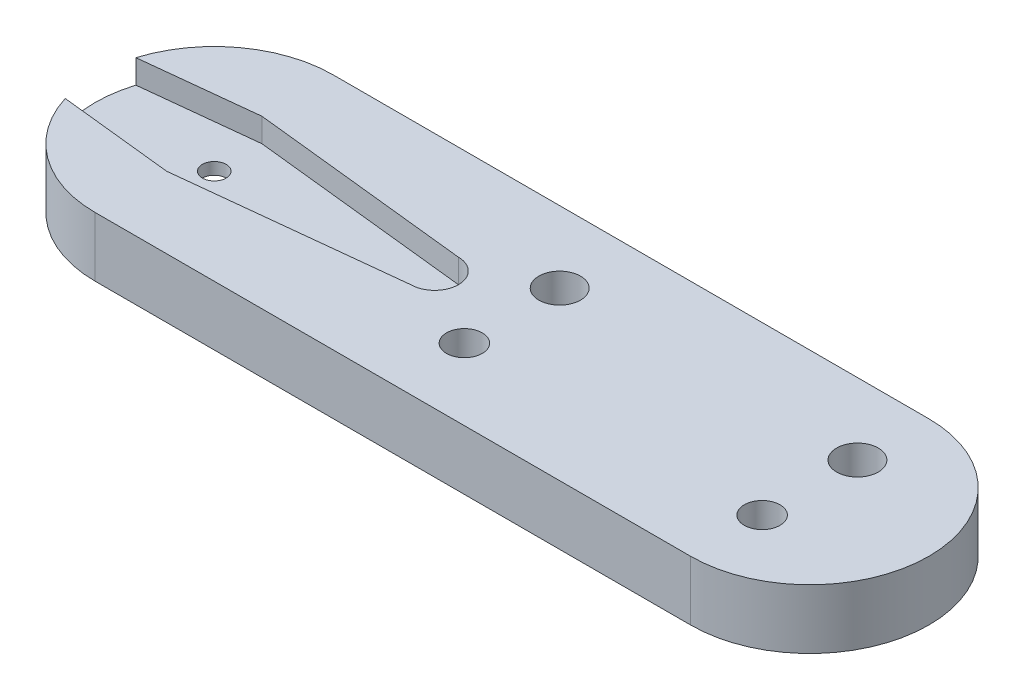
ISO-10303-21;
HEADER;
FILE_DESCRIPTION(('STEP AP214'),'2;1');
FILE_NAME('part.step','',(''),(''),'','','');
FILE_SCHEMA(('AUTOMOTIVE_DESIGN { 1 0 10303 214 1 1 1 1 }'));
ENDSEC;
DATA;
#1=APPLICATION_CONTEXT('core data for automotive mechanical design processes');
#2=APPLICATION_PROTOCOL_DEFINITION('international standard','automotive_design',2000,#1);
#3=PRODUCT_CONTEXT('',#1,'mechanical');
#4=PRODUCT('Part','Part','',(#3));
#5=PRODUCT_RELATED_PRODUCT_CATEGORY('part','',(#4));
#6=PRODUCT_DEFINITION_FORMATION('','',#4);
#7=PRODUCT_DEFINITION_CONTEXT('part definition',#1,'design');
#8=PRODUCT_DEFINITION('design','',#6,#7);
#9=PRODUCT_DEFINITION_SHAPE('','',#8);
#10=(LENGTH_UNIT() NAMED_UNIT(*) SI_UNIT(.MILLI.,.METRE.));
#11=(NAMED_UNIT(*) PLANE_ANGLE_UNIT() SI_UNIT($,.RADIAN.));
#12=(NAMED_UNIT(*) SI_UNIT($,.STERADIAN.) SOLID_ANGLE_UNIT());
#13=UNCERTAINTY_MEASURE_WITH_UNIT(LENGTH_MEASURE(1.E-05),#10,'distance_accuracy_value','');
#14=(GEOMETRIC_REPRESENTATION_CONTEXT(3) GLOBAL_UNCERTAINTY_ASSIGNED_CONTEXT((#13)) GLOBAL_UNIT_ASSIGNED_CONTEXT((#10,
#11,#12)) REPRESENTATION_CONTEXT('',''));
#15=CARTESIAN_POINT('',(0.,0.,0.));
#16=DIRECTION('',(0.,0.,1.));
#17=DIRECTION('',(1.,0.,0.));
#18=AXIS2_PLACEMENT_3D('',#15,#16,#17);
#19=CARTESIAN_POINT('',(-25.,0.,0.));
#20=DIRECTION('',(0.,1.,0.));
#21=DIRECTION('',(0.,0.,1.));
#22=AXIS2_PLACEMENT_3D('',#19,#20,#21);
#23=CYLINDRICAL_SURFACE('',#22,1.);
#24=CARTESIAN_POINT('',(-25.,3.,0.));
#25=DIRECTION('',(0.,1.,0.));
#26=DIRECTION('',(0.,0.,1.));
#27=AXIS2_PLACEMENT_3D('',#24,#25,#26);
#28=CIRCLE('',#27,1.);
#29=CARTESIAN_POINT('',(-25.,3.,1.));
#30=VERTEX_POINT('',#29);
#31=EDGE_CURVE('E156',#30,#30,#28,.F.);
#32=ORIENTED_EDGE('',*,*,#31,.F.);
#33=EDGE_LOOP('',(#32));
#34=FACE_BOUND('',#33,.T.);
#35=CARTESIAN_POINT('',(-25.,2.,0.));
#36=DIRECTION('',(0.,-1.,0.));
#37=DIRECTION('',(0.,0.,-1.));
#38=AXIS2_PLACEMENT_3D('',#35,#36,#37);
#39=CIRCLE('',#38,1.);
#40=CARTESIAN_POINT('',(-25.,2.,-1.));
#41=VERTEX_POINT('',#40);
#42=EDGE_CURVE('E43',#41,#41,#39,.F.);
#43=ORIENTED_EDGE('',*,*,#42,.F.);
#44=EDGE_LOOP('',(#43));
#45=FACE_BOUND('',#44,.T.);
#46=ADVANCED_FACE('F39',(#34,#45),#23,.F.);
#47=CARTESIAN_POINT('',(-25.,5.,0.));
#48=DIRECTION('',(0.,-1.,0.));
#49=DIRECTION('',(0.,0.,-1.));
#50=AXIS2_PLACEMENT_3D('',#47,#48,#49);
#51=CYLINDRICAL_SURFACE('',#50,10.);
#52=DIRECTION('',(0.,-1.,0.));
#53=VECTOR('',#52,1.);
#54=CARTESIAN_POINT('',(-34.5495147182902,5.,-2.96762003045511));
#55=LINE('',#54,#53);
#56=CARTESIAN_POINT('',(-34.5495147182902,5.,-2.96762003045511));
#57=VERTEX_POINT('',#56);
#58=CARTESIAN_POINT('',(-34.5495147182902,3.,-2.96762003045511));
#59=VERTEX_POINT('',#58);
#60=EDGE_CURVE('E136',#57,#59,#55,.T.);
#61=ORIENTED_EDGE('',*,*,#60,.F.);
#62=CARTESIAN_POINT('',(-25.,5.,0.));
#63=DIRECTION('',(0.,1.,0.));
#64=DIRECTION('',(0.,0.,1.));
#65=AXIS2_PLACEMENT_3D('',#62,#63,#64);
#66=CIRCLE('',#65,10.);
#67=CARTESIAN_POINT('',(-25.,5.,-10.));
#68=VERTEX_POINT('',#67);
#69=EDGE_CURVE('E180',#68,#57,#66,.T.);
#70=ORIENTED_EDGE('',*,*,#69,.F.);
#71=DIRECTION('',(0.,-1.,0.));
#72=VECTOR('',#71,1.);
#73=CARTESIAN_POINT('',(-25.,5.,-10.));
#74=LINE('',#73,#72);
#75=CARTESIAN_POINT('',(-25.,0.,-10.));
#76=VERTEX_POINT('',#75);
#77=EDGE_CURVE('E49',#68,#76,#74,.T.);
#78=ORIENTED_EDGE('',*,*,#77,.T.);
#79=CARTESIAN_POINT('',(-25.,0.,0.));
#80=DIRECTION('',(0.,1.,0.));
#81=DIRECTION('',(0.,0.,1.));
#82=AXIS2_PLACEMENT_3D('',#79,#80,#81);
#83=CIRCLE('',#82,10.);
#84=CARTESIAN_POINT('',(-25.,0.,10.));
#85=VERTEX_POINT('',#84);
#86=EDGE_CURVE('E193',#76,#85,#83,.T.);
#87=ORIENTED_EDGE('',*,*,#86,.T.);
#88=DIRECTION('',(0.,-1.,0.));
#89=VECTOR('',#88,1.);
#90=CARTESIAN_POINT('',(-25.,5.,10.));
#91=LINE('',#90,#89);
#92=CARTESIAN_POINT('',(-25.,5.,10.));
#93=VERTEX_POINT('',#92);
#94=EDGE_CURVE('E200',#93,#85,#91,.T.);
#95=ORIENTED_EDGE('',*,*,#94,.F.);
#96=CARTESIAN_POINT('',(-34.5495147182902,5.,2.96762003045511));
#97=VERTEX_POINT('',#96);
#98=EDGE_CURVE('E179',#97,#93,#66,.T.);
#99=ORIENTED_EDGE('',*,*,#98,.F.);
#100=DIRECTION('',(0.,-1.,0.));
#101=VECTOR('',#100,1.);
#102=CARTESIAN_POINT('',(-34.5495147182902,5.,2.96762003045511));
#103=LINE('',#102,#101);
#104=CARTESIAN_POINT('',(-34.5495147182902,3.,2.96762003045511));
#105=VERTEX_POINT('',#104);
#106=EDGE_CURVE('E57',#97,#105,#103,.T.);
#107=ORIENTED_EDGE('',*,*,#106,.T.);
#108=CARTESIAN_POINT('',(-25.,3.,0.));
#109=DIRECTION('',(0.,1.,0.));
#110=DIRECTION('',(0.,0.,1.));
#111=AXIS2_PLACEMENT_3D('',#108,#109,#110);
#112=CIRCLE('',#111,10.);
#113=EDGE_CURVE('E162',#59,#105,#112,.T.);
#114=ORIENTED_EDGE('',*,*,#113,.F.);
#115=EDGE_LOOP('',(#61,#70,#78,#87,#95,#99,#107,#114));
#116=FACE_BOUND('',#115,.T.);
#117=ADVANCED_FACE('F208',(#116),#51,.T.);
#118=CARTESIAN_POINT('',(25.,5.,0.));
#119=DIRECTION('',(0.,1.,0.));
#120=DIRECTION('',(0.,0.,1.));
#121=AXIS2_PLACEMENT_3D('',#118,#119,#120);
#122=PLANE('',#121);
#123=CARTESIAN_POINT('',(0.,5.,-4.));
#124=DIRECTION('',(0.,1.,0.));
#125=DIRECTION('',(0.,0.,1.));
#126=AXIS2_PLACEMENT_3D('',#123,#124,#125);
#127=CIRCLE('',#126,1.75);
#128=CARTESIAN_POINT('',(0.,5.,-2.25));
#129=VERTEX_POINT('',#128);
#130=EDGE_CURVE('E290',#129,#129,#127,.T.);
#131=ORIENTED_EDGE('',*,*,#130,.F.);
#132=EDGE_LOOP('',(#131));
#133=FACE_BOUND('',#132,.T.);
#134=CARTESIAN_POINT('',(0.,5.,4.));
#135=DIRECTION('',(0.,1.,0.));
#136=DIRECTION('',(0.,0.,1.));
#137=AXIS2_PLACEMENT_3D('',#134,#135,#136);
#138=CIRCLE('',#137,1.5);
#139=CARTESIAN_POINT('',(0.,5.,5.5));
#140=VERTEX_POINT('',#139);
#141=EDGE_CURVE('E282',#140,#140,#138,.T.);
#142=ORIENTED_EDGE('',*,*,#141,.F.);
#143=EDGE_LOOP('',(#142));
#144=FACE_BOUND('',#143,.T.);
#145=CARTESIAN_POINT('',(25.,5.,-4.));
#146=DIRECTION('',(0.,1.,0.));
#147=DIRECTION('',(0.,0.,1.));
#148=AXIS2_PLACEMENT_3D('',#145,#146,#147);
#149=CIRCLE('',#148,1.75);
#150=CARTESIAN_POINT('',(25.,5.,-2.25));
#151=VERTEX_POINT('',#150);
#152=EDGE_CURVE('E275',#151,#151,#149,.T.);
#153=ORIENTED_EDGE('',*,*,#152,.F.);
#154=EDGE_LOOP('',(#153));
#155=FACE_BOUND('',#154,.T.);
#156=CARTESIAN_POINT('',(25.,5.,4.));
#157=DIRECTION('',(0.,1.,0.));
#158=DIRECTION('',(0.,0.,1.));
#159=AXIS2_PLACEMENT_3D('',#156,#157,#158);
#160=CIRCLE('',#159,1.5);
#161=CARTESIAN_POINT('',(25.,5.,5.5));
#162=VERTEX_POINT('',#161);
#163=EDGE_CURVE('E266',#162,#162,#160,.T.);
#164=ORIENTED_EDGE('',*,*,#163,.F.);
#165=EDGE_LOOP('',(#164));
#166=FACE_BOUND('',#165,.T.);
#167=ORIENTED_EDGE('',*,*,#69,.T.);
#168=DIRECTION('',(0.994207047565849,0.,-0.107481842980092));
#169=VECTOR('',#168,1.);
#170=CARTESIAN_POINT('',(-43.5,5.,-2.));
#171=LINE('',#170,#169);
#172=CARTESIAN_POINT('',(-25.,5.,-4.));
#173=VERTEX_POINT('',#172);
#174=EDGE_CURVE('E245',#57,#173,#171,.T.);
#175=ORIENTED_EDGE('',*,*,#174,.T.);
#176=DIRECTION('',(0.994207047565849,0.,0.107481842980092));
#177=VECTOR('',#176,1.);
#178=CARTESIAN_POINT('',(-25.,5.,-4.));
#179=LINE('',#178,#177);
#180=CARTESIAN_POINT('',(-6.49999999999996,5.,-2.));
#181=VERTEX_POINT('',#180);
#182=EDGE_CURVE('E154',#173,#181,#179,.T.);
#183=ORIENTED_EDGE('',*,*,#182,.T.);
#184=CARTESIAN_POINT('',(-6.49999999999996,5.,0.));
#185=DIRECTION('',(0.,1.,0.));
#186=DIRECTION('',(0.,0.,1.));
#187=AXIS2_PLACEMENT_3D('',#184,#185,#186);
#188=CIRCLE('',#187,2.);
#189=CARTESIAN_POINT('',(-6.49999999999996,5.,2.));
#190=VERTEX_POINT('',#189);
#191=EDGE_CURVE('E229',#190,#181,#188,.T.);
#192=ORIENTED_EDGE('',*,*,#191,.F.);
#193=DIRECTION('',(0.994207047565849,0.,-0.107481842980092));
#194=VECTOR('',#193,1.);
#195=CARTESIAN_POINT('',(-25.,5.,4.));
#196=LINE('',#195,#194);
#197=CARTESIAN_POINT('',(-25.,5.,4.));
#198=VERTEX_POINT('',#197);
#199=EDGE_CURVE('E223',#198,#190,#196,.T.);
#200=ORIENTED_EDGE('',*,*,#199,.F.);
#201=DIRECTION('',(0.994207047565849,0.,0.107481842980092));
#202=VECTOR('',#201,1.);
#203=CARTESIAN_POINT('',(-43.5,5.,2.));
#204=LINE('',#203,#202);
#205=EDGE_CURVE('E141',#97,#198,#204,.T.);
#206=ORIENTED_EDGE('',*,*,#205,.F.);
#207=ORIENTED_EDGE('',*,*,#98,.T.);
#208=DIRECTION('',(1.,0.,0.));
#209=VECTOR('',#208,1.);
#210=CARTESIAN_POINT('',(-25.,5.,10.));
#211=LINE('',#210,#209);
#212=CARTESIAN_POINT('',(25.,5.,10.));
#213=VERTEX_POINT('',#212);
#214=EDGE_CURVE('E66',#93,#213,#211,.T.);
#215=ORIENTED_EDGE('',*,*,#214,.T.);
#216=CARTESIAN_POINT('',(25.,5.,0.));
#217=DIRECTION('',(0.,1.,0.));
#218=DIRECTION('',(0.,0.,1.));
#219=AXIS2_PLACEMENT_3D('',#216,#217,#218);
#220=CIRCLE('',#219,10.);
#221=CARTESIAN_POINT('',(25.,5.,-10.));
#222=VERTEX_POINT('',#221);
#223=EDGE_CURVE('E174',#213,#222,#220,.T.);
#224=ORIENTED_EDGE('',*,*,#223,.T.);
#225=DIRECTION('',(-1.,0.,0.));
#226=VECTOR('',#225,1.);
#227=CARTESIAN_POINT('',(-25.,5.,-10.));
#228=LINE('',#227,#226);
#229=EDGE_CURVE('E94',#222,#68,#228,.T.);
#230=ORIENTED_EDGE('',*,*,#229,.T.);
#231=EDGE_LOOP('',(#167,#175,#183,#192,#200,#206,#207,#215,#224,#230));
#232=FACE_BOUND('',#231,.T.);
#233=ADVANCED_FACE('F219',(#133,#144,#155,#166,#232),#122,.T.);
#234=CARTESIAN_POINT('',(25.,5.,0.));
#235=DIRECTION('',(0.,-1.,0.));
#236=DIRECTION('',(0.,0.,-1.));
#237=AXIS2_PLACEMENT_3D('',#234,#235,#236);
#238=CYLINDRICAL_SURFACE('',#237,10.);
#239=CARTESIAN_POINT('',(25.,0.,0.));
#240=DIRECTION('',(0.,1.,0.));
#241=DIRECTION('',(0.,0.,1.));
#242=AXIS2_PLACEMENT_3D('',#239,#240,#241);
#243=CIRCLE('',#242,10.);
#244=CARTESIAN_POINT('',(25.,0.,10.));
#245=VERTEX_POINT('',#244);
#246=CARTESIAN_POINT('',(25.,0.,-10.));
#247=VERTEX_POINT('',#246);
#248=EDGE_CURVE('E173',#245,#247,#243,.T.);
#249=ORIENTED_EDGE('',*,*,#248,.T.);
#250=DIRECTION('',(0.,-1.,0.));
#251=VECTOR('',#250,1.);
#252=CARTESIAN_POINT('',(25.,5.,-10.));
#253=LINE('',#252,#251);
#254=EDGE_CURVE('E11',#222,#247,#253,.T.);
#255=ORIENTED_EDGE('',*,*,#254,.F.);
#256=ORIENTED_EDGE('',*,*,#223,.F.);
#257=DIRECTION('',(0.,-1.,0.));
#258=VECTOR('',#257,1.);
#259=CARTESIAN_POINT('',(25.,5.,10.));
#260=LINE('',#259,#258);
#261=EDGE_CURVE('E186',#213,#245,#260,.T.);
#262=ORIENTED_EDGE('',*,*,#261,.T.);
#263=EDGE_LOOP('',(#249,#255,#256,#262));
#264=FACE_BOUND('',#263,.T.);
#265=ADVANCED_FACE('F41',(#264),#238,.T.);
#266=CARTESIAN_POINT('',(-25.,5.,-10.));
#267=DIRECTION('',(0.,0.,1.));
#268=DIRECTION('',(1.,0.,0.));
#269=AXIS2_PLACEMENT_3D('',#266,#267,#268);
#270=PLANE('',#269);
#271=DIRECTION('',(-1.,0.,0.));
#272=VECTOR('',#271,1.);
#273=CARTESIAN_POINT('',(-25.,0.,-10.));
#274=LINE('',#273,#272);
#275=EDGE_CURVE('E190',#247,#76,#274,.T.);
#276=ORIENTED_EDGE('',*,*,#275,.T.);
#277=ORIENTED_EDGE('',*,*,#77,.F.);
#278=ORIENTED_EDGE('',*,*,#229,.F.);
#279=ORIENTED_EDGE('',*,*,#254,.T.);
#280=EDGE_LOOP('',(#276,#277,#278,#279));
#281=FACE_BOUND('',#280,.T.);
#282=ADVANCED_FACE('F348',(#281),#270,.F.);
#283=CARTESIAN_POINT('',(-25.,5.,10.));
#284=DIRECTION('',(0.,0.,-1.));
#285=DIRECTION('',(-1.,0.,0.));
#286=AXIS2_PLACEMENT_3D('',#283,#284,#285);
#287=PLANE('',#286);
#288=DIRECTION('',(1.,0.,0.));
#289=VECTOR('',#288,1.);
#290=CARTESIAN_POINT('',(-25.,0.,10.));
#291=LINE('',#290,#289);
#292=EDGE_CURVE('E87',#85,#245,#291,.T.);
#293=ORIENTED_EDGE('',*,*,#292,.T.);
#294=ORIENTED_EDGE('',*,*,#261,.F.);
#295=ORIENTED_EDGE('',*,*,#214,.F.);
#296=ORIENTED_EDGE('',*,*,#94,.T.);
#297=EDGE_LOOP('',(#293,#294,#295,#296));
#298=FACE_BOUND('',#297,.T.);
#299=ADVANCED_FACE('F216',(#298),#287,.F.);
#300=CARTESIAN_POINT('',(25.,0.,0.));
#301=DIRECTION('',(0.,1.,0.));
#302=DIRECTION('',(0.,0.,1.));
#303=AXIS2_PLACEMENT_3D('',#300,#301,#302);
#304=PLANE('',#303);
#305=CARTESIAN_POINT('',(0.,0.,-4.));
#306=DIRECTION('',(0.,1.,0.));
#307=DIRECTION('',(0.,0.,1.));
#308=AXIS2_PLACEMENT_3D('',#305,#306,#307);
#309=CIRCLE('',#308,1.75);
#310=CARTESIAN_POINT('',(0.,0.,-2.25));
#311=VERTEX_POINT('',#310);
#312=EDGE_CURVE('E271',#311,#311,#309,.T.);
#313=ORIENTED_EDGE('',*,*,#312,.T.);
#314=EDGE_LOOP('',(#313));
#315=FACE_BOUND('',#314,.T.);
#316=CARTESIAN_POINT('',(0.,0.,4.));
#317=DIRECTION('',(0.,1.,0.));
#318=DIRECTION('',(0.,0.,1.));
#319=AXIS2_PLACEMENT_3D('',#316,#317,#318);
#320=CIRCLE('',#319,1.5);
#321=CARTESIAN_POINT('',(0.,0.,5.5));
#322=VERTEX_POINT('',#321);
#323=EDGE_CURVE('E286',#322,#322,#320,.T.);
#324=ORIENTED_EDGE('',*,*,#323,.T.);
#325=EDGE_LOOP('',(#324));
#326=FACE_BOUND('',#325,.T.);
#327=CARTESIAN_POINT('',(25.,0.,-4.));
#328=DIRECTION('',(0.,1.,0.));
#329=DIRECTION('',(0.,0.,1.));
#330=AXIS2_PLACEMENT_3D('',#327,#328,#329);
#331=CIRCLE('',#330,1.75);
#332=CARTESIAN_POINT('',(25.,0.,-2.25));
#333=VERTEX_POINT('',#332);
#334=EDGE_CURVE('E262',#333,#333,#331,.T.);
#335=ORIENTED_EDGE('',*,*,#334,.T.);
#336=EDGE_LOOP('',(#335));
#337=FACE_BOUND('',#336,.T.);
#338=CARTESIAN_POINT('',(25.,0.,4.));
#339=DIRECTION('',(0.,1.,0.));
#340=DIRECTION('',(0.,0.,1.));
#341=AXIS2_PLACEMENT_3D('',#338,#339,#340);
#342=CIRCLE('',#341,1.5);
#343=CARTESIAN_POINT('',(25.,0.,5.5));
#344=VERTEX_POINT('',#343);
#345=EDGE_CURVE('E270',#344,#344,#342,.T.);
#346=ORIENTED_EDGE('',*,*,#345,.T.);
#347=EDGE_LOOP('',(#346));
#348=FACE_BOUND('',#347,.T.);
#349=CARTESIAN_POINT('',(-25.,0.,0.));
#350=DIRECTION('',(0.,-1.,0.));
#351=DIRECTION('',(0.,0.,-1.));
#352=AXIS2_PLACEMENT_3D('',#349,#350,#351);
#353=CIRCLE('',#352,4.);
#354=CARTESIAN_POINT('',(-25.,0.,-4.));
#355=VERTEX_POINT('',#354);
#356=EDGE_CURVE('E257',#355,#355,#353,.T.);
#357=ORIENTED_EDGE('',*,*,#356,.F.);
#358=EDGE_LOOP('',(#357));
#359=FACE_BOUND('',#358,.T.);
#360=ORIENTED_EDGE('',*,*,#248,.F.);
#361=ORIENTED_EDGE('',*,*,#292,.F.);
#362=ORIENTED_EDGE('',*,*,#86,.F.);
#363=ORIENTED_EDGE('',*,*,#275,.F.);
#364=EDGE_LOOP('',(#360,#361,#362,#363));
#365=FACE_BOUND('',#364,.T.);
#366=ADVANCED_FACE('F212',(#315,#326,#337,#348,#359,#365),#304,.F.);
#367=CARTESIAN_POINT('',(-43.5,3.,-2.));
#368=DIRECTION('',(0.107481842980092,0.,0.994207047565849));
#369=DIRECTION('',(0.994207047565849,0.,-0.107481842980092));
#370=AXIS2_PLACEMENT_3D('',#367,#368,#369);
#371=PLANE('',#370);
#372=ORIENTED_EDGE('',*,*,#60,.T.);
#373=DIRECTION('',(0.994207047565849,0.,-0.107481842980092));
#374=VECTOR('',#373,1.);
#375=CARTESIAN_POINT('',(-43.5,3.,-2.));
#376=LINE('',#375,#374);
#377=CARTESIAN_POINT('',(-25.,3.,-4.));
#378=VERTEX_POINT('',#377);
#379=EDGE_CURVE('E129',#59,#378,#376,.T.);
#380=ORIENTED_EDGE('',*,*,#379,.T.);
#381=DIRECTION('',(0.,1.,0.));
#382=VECTOR('',#381,1.);
#383=CARTESIAN_POINT('',(-25.,3.,-4.));
#384=LINE('',#383,#382);
#385=EDGE_CURVE('E133',#378,#173,#384,.T.);
#386=ORIENTED_EDGE('',*,*,#385,.T.);
#387=ORIENTED_EDGE('',*,*,#174,.F.);
#388=EDGE_LOOP('',(#372,#380,#386,#387));
#389=FACE_BOUND('',#388,.T.);
#390=ADVANCED_FACE('F131',(#389),#371,.T.);
#391=CARTESIAN_POINT('',(-43.5,3.,2.));
#392=DIRECTION('',(-0.107481842980092,0.,0.994207047565849));
#393=DIRECTION('',(0.994207047565849,0.,0.107481842980092));
#394=AXIS2_PLACEMENT_3D('',#391,#392,#393);
#395=PLANE('',#394);
#396=ORIENTED_EDGE('',*,*,#205,.T.);
#397=DIRECTION('',(0.,1.,0.));
#398=VECTOR('',#397,1.);
#399=CARTESIAN_POINT('',(-25.,3.,4.));
#400=LINE('',#399,#398);
#401=CARTESIAN_POINT('',(-25.,3.,4.));
#402=VERTEX_POINT('',#401);
#403=EDGE_CURVE('E233',#402,#198,#400,.T.);
#404=ORIENTED_EDGE('',*,*,#403,.F.);
#405=DIRECTION('',(0.994207047565849,0.,0.107481842980092));
#406=VECTOR('',#405,1.);
#407=CARTESIAN_POINT('',(-43.5,3.,2.));
#408=LINE('',#407,#406);
#409=EDGE_CURVE('E235',#105,#402,#408,.T.);
#410=ORIENTED_EDGE('',*,*,#409,.F.);
#411=ORIENTED_EDGE('',*,*,#106,.F.);
#412=EDGE_LOOP('',(#396,#404,#410,#411));
#413=FACE_BOUND('',#412,.T.);
#414=ADVANCED_FACE('F377',(#413),#395,.F.);
#415=CARTESIAN_POINT('',(-6.49999999999996,3.,0.));
#416=DIRECTION('',(0.,1.,0.));
#417=DIRECTION('',(0.,0.,1.));
#418=AXIS2_PLACEMENT_3D('',#415,#416,#417);
#419=PLANE('',#418);
#420=ORIENTED_EDGE('',*,*,#31,.T.);
#421=EDGE_LOOP('',(#420));
#422=FACE_BOUND('',#421,.T.);
#423=ORIENTED_EDGE('',*,*,#113,.T.);
#424=ORIENTED_EDGE('',*,*,#409,.T.);
#425=DIRECTION('',(0.994207047565849,0.,-0.107481842980092));
#426=VECTOR('',#425,1.);
#427=CARTESIAN_POINT('',(-25.,3.,4.));
#428=LINE('',#427,#426);
#429=CARTESIAN_POINT('',(-6.49999999999996,3.,2.));
#430=VERTEX_POINT('',#429);
#431=EDGE_CURVE('E252',#402,#430,#428,.T.);
#432=ORIENTED_EDGE('',*,*,#431,.T.);
#433=CARTESIAN_POINT('',(-6.49999999999996,3.,0.));
#434=DIRECTION('',(0.,1.,0.));
#435=DIRECTION('',(0.,0.,1.));
#436=AXIS2_PLACEMENT_3D('',#433,#434,#435);
#437=CIRCLE('',#436,2.);
#438=CARTESIAN_POINT('',(-6.49999999999996,3.,-2.));
#439=VERTEX_POINT('',#438);
#440=EDGE_CURVE('E147',#430,#439,#437,.T.);
#441=ORIENTED_EDGE('',*,*,#440,.T.);
#442=DIRECTION('',(0.994207047565849,0.,0.107481842980092));
#443=VECTOR('',#442,1.);
#444=CARTESIAN_POINT('',(-25.,3.,-4.));
#445=LINE('',#444,#443);
#446=EDGE_CURVE('E140',#378,#439,#445,.T.);
#447=ORIENTED_EDGE('',*,*,#446,.F.);
#448=ORIENTED_EDGE('',*,*,#379,.F.);
#449=EDGE_LOOP('',(#423,#424,#432,#441,#447,#448));
#450=FACE_BOUND('',#449,.T.);
#451=ADVANCED_FACE('F144',(#422,#450),#419,.T.);
#452=CARTESIAN_POINT('',(-25.,3.,-4.));
#453=DIRECTION('',(-0.107481842980092,0.,0.994207047565849));
#454=DIRECTION('',(0.994207047565849,0.,0.107481842980092));
#455=AXIS2_PLACEMENT_3D('',#452,#453,#454);
#456=PLANE('',#455);
#457=ORIENTED_EDGE('',*,*,#182,.F.);
#458=ORIENTED_EDGE('',*,*,#385,.F.);
#459=ORIENTED_EDGE('',*,*,#446,.T.);
#460=DIRECTION('',(0.,1.,0.));
#461=VECTOR('',#460,1.);
#462=CARTESIAN_POINT('',(-6.49999999999996,3.,-2.));
#463=LINE('',#462,#461);
#464=EDGE_CURVE('E157',#439,#181,#463,.T.);
#465=ORIENTED_EDGE('',*,*,#464,.T.);
#466=EDGE_LOOP('',(#457,#458,#459,#465));
#467=FACE_BOUND('',#466,.T.);
#468=ADVANCED_FACE('F152',(#467),#456,.T.);
#469=CARTESIAN_POINT('',(-6.49999999999996,3.,0.));
#470=DIRECTION('',(0.,1.,0.));
#471=DIRECTION('',(0.,0.,1.));
#472=AXIS2_PLACEMENT_3D('',#469,#470,#471);
#473=CYLINDRICAL_SURFACE('',#472,2.);
#474=ORIENTED_EDGE('',*,*,#191,.T.);
#475=ORIENTED_EDGE('',*,*,#464,.F.);
#476=ORIENTED_EDGE('',*,*,#440,.F.);
#477=DIRECTION('',(0.,1.,0.));
#478=VECTOR('',#477,1.);
#479=CARTESIAN_POINT('',(-6.49999999999996,3.,2.));
#480=LINE('',#479,#478);
#481=EDGE_CURVE('E163',#430,#190,#480,.T.);
#482=ORIENTED_EDGE('',*,*,#481,.T.);
#483=EDGE_LOOP('',(#474,#475,#476,#482));
#484=FACE_BOUND('',#483,.T.);
#485=ADVANCED_FACE('F239',(#484),#473,.F.);
#486=CARTESIAN_POINT('',(-25.,3.,4.));
#487=DIRECTION('',(0.107481842980092,0.,0.994207047565849));
#488=DIRECTION('',(0.994207047565849,0.,-0.107481842980092));
#489=AXIS2_PLACEMENT_3D('',#486,#487,#488);
#490=PLANE('',#489);
#491=ORIENTED_EDGE('',*,*,#199,.T.);
#492=ORIENTED_EDGE('',*,*,#481,.F.);
#493=ORIENTED_EDGE('',*,*,#431,.F.);
#494=ORIENTED_EDGE('',*,*,#403,.T.);
#495=EDGE_LOOP('',(#491,#492,#493,#494));
#496=FACE_BOUND('',#495,.T.);
#497=ADVANCED_FACE('F242',(#496),#490,.F.);
#498=CARTESIAN_POINT('',(-25.,2.,0.));
#499=DIRECTION('',(0.,-1.,0.));
#500=DIRECTION('',(0.,0.,-1.));
#501=AXIS2_PLACEMENT_3D('',#498,#499,#500);
#502=PLANE('',#501);
#503=CARTESIAN_POINT('',(-25.,2.,0.));
#504=DIRECTION('',(0.,-1.,0.));
#505=DIRECTION('',(0.,0.,-1.));
#506=AXIS2_PLACEMENT_3D('',#503,#504,#505);
#507=CIRCLE('',#506,4.);
#508=CARTESIAN_POINT('',(-25.,2.,-4.));
#509=VERTEX_POINT('',#508);
#510=EDGE_CURVE('E261',#509,#509,#507,.T.);
#511=ORIENTED_EDGE('',*,*,#510,.T.);
#512=EDGE_LOOP('',(#511));
#513=FACE_BOUND('',#512,.T.);
#514=ORIENTED_EDGE('',*,*,#42,.T.);
#515=EDGE_LOOP('',(#514));
#516=FACE_BOUND('',#515,.T.);
#517=ADVANCED_FACE('F328',(#513,#516),#502,.T.);
#518=CARTESIAN_POINT('',(-25.,2.,0.));
#519=DIRECTION('',(0.,-1.,0.));
#520=DIRECTION('',(0.,0.,-1.));
#521=AXIS2_PLACEMENT_3D('',#518,#519,#520);
#522=CYLINDRICAL_SURFACE('',#521,4.);
#523=ORIENTED_EDGE('',*,*,#510,.F.);
#524=EDGE_LOOP('',(#523));
#525=FACE_BOUND('',#524,.T.);
#526=ORIENTED_EDGE('',*,*,#356,.T.);
#527=EDGE_LOOP('',(#526));
#528=FACE_BOUND('',#527,.T.);
#529=ADVANCED_FACE('F319',(#525,#528),#522,.F.);
#530=CARTESIAN_POINT('',(25.,0.,4.));
#531=DIRECTION('',(0.,1.,0.));
#532=DIRECTION('',(0.,0.,1.));
#533=AXIS2_PLACEMENT_3D('',#530,#531,#532);
#534=CYLINDRICAL_SURFACE('',#533,1.5);
#535=ORIENTED_EDGE('',*,*,#345,.F.);
#536=EDGE_LOOP('',(#535));
#537=FACE_BOUND('',#536,.T.);
#538=ORIENTED_EDGE('',*,*,#163,.T.);
#539=EDGE_LOOP('',(#538));
#540=FACE_BOUND('',#539,.T.);
#541=ADVANCED_FACE('F316',(#537,#540),#534,.F.);
#542=CARTESIAN_POINT('',(25.,0.,-4.));
#543=DIRECTION('',(0.,1.,0.));
#544=DIRECTION('',(0.,0.,1.));
#545=AXIS2_PLACEMENT_3D('',#542,#543,#544);
#546=CYLINDRICAL_SURFACE('',#545,1.75);
#547=ORIENTED_EDGE('',*,*,#334,.F.);
#548=EDGE_LOOP('',(#547));
#549=FACE_BOUND('',#548,.T.);
#550=ORIENTED_EDGE('',*,*,#152,.T.);
#551=EDGE_LOOP('',(#550));
#552=FACE_BOUND('',#551,.T.);
#553=ADVANCED_FACE('F318',(#549,#552),#546,.F.);
#554=CARTESIAN_POINT('',(0.,0.,4.));
#555=DIRECTION('',(0.,1.,0.));
#556=DIRECTION('',(0.,0.,1.));
#557=AXIS2_PLACEMENT_3D('',#554,#555,#556);
#558=CYLINDRICAL_SURFACE('',#557,1.5);
#559=ORIENTED_EDGE('',*,*,#323,.F.);
#560=EDGE_LOOP('',(#559));
#561=FACE_BOUND('',#560,.T.);
#562=ORIENTED_EDGE('',*,*,#141,.T.);
#563=EDGE_LOOP('',(#562));
#564=FACE_BOUND('',#563,.T.);
#565=ADVANCED_FACE('F303',(#561,#564),#558,.F.);
#566=CARTESIAN_POINT('',(0.,0.,-4.));
#567=DIRECTION('',(0.,1.,0.));
#568=DIRECTION('',(0.,0.,1.));
#569=AXIS2_PLACEMENT_3D('',#566,#567,#568);
#570=CYLINDRICAL_SURFACE('',#569,1.75);
#571=ORIENTED_EDGE('',*,*,#312,.F.);
#572=EDGE_LOOP('',(#571));
#573=FACE_BOUND('',#572,.T.);
#574=ORIENTED_EDGE('',*,*,#130,.T.);
#575=EDGE_LOOP('',(#574));
#576=FACE_BOUND('',#575,.T.);
#577=ADVANCED_FACE('F300',(#573,#576),#570,.F.);
#578=CLOSED_SHELL('',(#46,#117,#233,#265,#282,#299,#366,#390,#414,#451,#468,#485,#497,#517,#529,
#541,#553,#565,#577));
#579=MANIFOLD_SOLID_BREP('B2',#578);
#580=ADVANCED_BREP_SHAPE_REPRESENTATION('',(#18,#579),#14);
#581=SHAPE_DEFINITION_REPRESENTATION(#9,#580);
ENDSEC;
END-ISO-10303-21;
